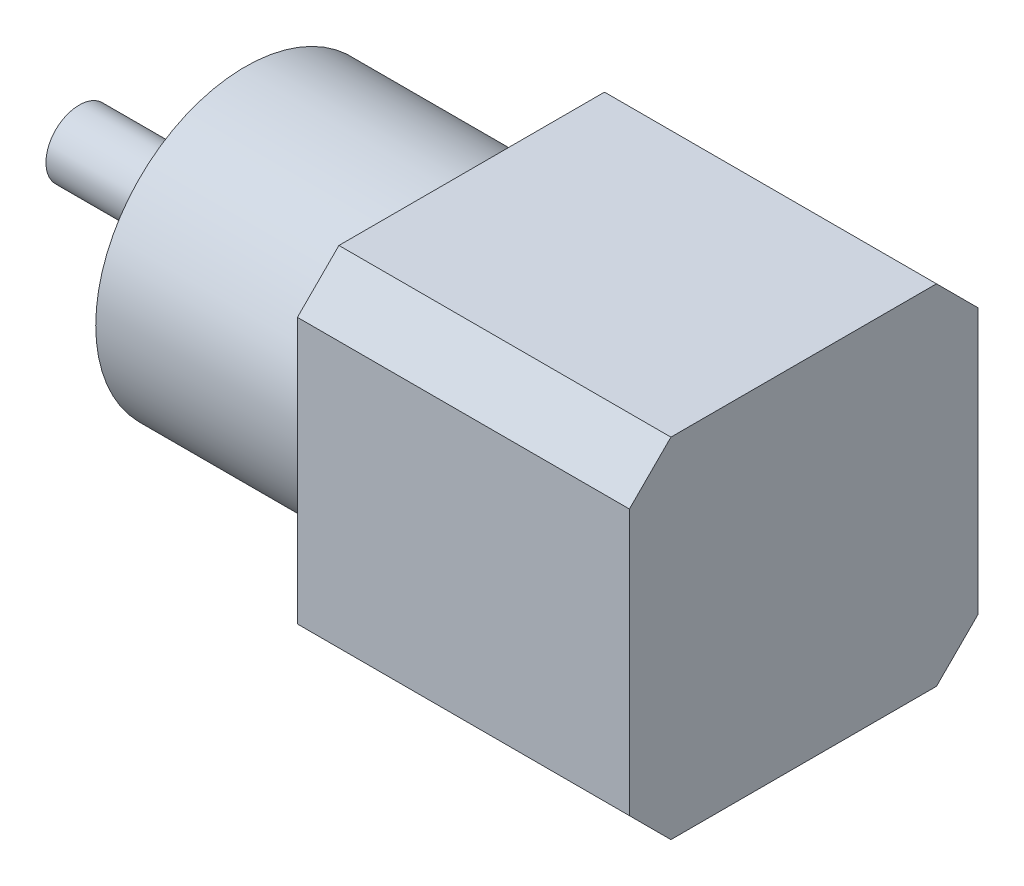
ISO-10303-21;
HEADER;
FILE_DESCRIPTION(('STEP AP214'),'2;1');
FILE_NAME('part.step','',(''),(''),'','','');
FILE_SCHEMA(('AUTOMOTIVE_DESIGN { 1 0 10303 214 1 1 1 1 }'));
ENDSEC;
DATA;
#1=APPLICATION_CONTEXT('core data for automotive mechanical design processes');
#2=APPLICATION_PROTOCOL_DEFINITION('international standard','automotive_design',2000,#1);
#3=PRODUCT_CONTEXT('',#1,'mechanical');
#4=PRODUCT('Part','Part','',(#3));
#5=PRODUCT_RELATED_PRODUCT_CATEGORY('part','',(#4));
#6=PRODUCT_DEFINITION_FORMATION('','',#4);
#7=PRODUCT_DEFINITION_CONTEXT('part definition',#1,'design');
#8=PRODUCT_DEFINITION('design','',#6,#7);
#9=PRODUCT_DEFINITION_SHAPE('','',#8);
#10=(LENGTH_UNIT() NAMED_UNIT(*) SI_UNIT(.MILLI.,.METRE.));
#11=(NAMED_UNIT(*) PLANE_ANGLE_UNIT() SI_UNIT($,.RADIAN.));
#12=(NAMED_UNIT(*) SI_UNIT($,.STERADIAN.) SOLID_ANGLE_UNIT());
#13=UNCERTAINTY_MEASURE_WITH_UNIT(LENGTH_MEASURE(1.E-05),#10,'distance_accuracy_value','');
#14=(GEOMETRIC_REPRESENTATION_CONTEXT(3) GLOBAL_UNCERTAINTY_ASSIGNED_CONTEXT((#13)) GLOBAL_UNIT_ASSIGNED_CONTEXT((#10,
#11,#12)) REPRESENTATION_CONTEXT('',''));
#15=CARTESIAN_POINT('',(0.,0.,0.));
#16=DIRECTION('',(0.,0.,1.));
#17=DIRECTION('',(1.,0.,0.));
#18=AXIS2_PLACEMENT_3D('',#15,#16,#17);
#19=CARTESIAN_POINT('',(49.8,-21.,-10.8));
#20=DIRECTION('',(0.,0.,-1.));
#21=DIRECTION('',(0.,1.,0.));
#22=AXIS2_PLACEMENT_3D('',#19,#20,#21);
#23=PLANE('',#22);
#24=DIRECTION('',(0.,1.,0.));
#25=VECTOR('',#24,1.);
#26=CARTESIAN_POINT('',(89.8,-21.,-10.8));
#27=LINE('',#26,#25);
#28=CARTESIAN_POINT('',(89.8,-16.,-10.8));
#29=VERTEX_POINT('',#28);
#30=CARTESIAN_POINT('',(89.8,16.,-10.8));
#31=VERTEX_POINT('',#30);
#32=EDGE_CURVE('E198',#29,#31,#27,.T.);
#33=ORIENTED_EDGE('',*,*,#32,.F.);
#34=DIRECTION('',(-1.,0.,0.));
#35=VECTOR('',#34,1.);
#36=CARTESIAN_POINT('',(49.8,-16.,-10.8));
#37=LINE('',#36,#35);
#38=CARTESIAN_POINT('',(49.8,-16.,-10.8));
#39=VERTEX_POINT('',#38);
#40=EDGE_CURVE('E238',#29,#39,#37,.T.);
#41=ORIENTED_EDGE('',*,*,#40,.T.);
#42=DIRECTION('',(0.,1.,0.));
#43=VECTOR('',#42,1.);
#44=CARTESIAN_POINT('',(49.8,-21.,-10.8));
#45=LINE('',#44,#43);
#46=CARTESIAN_POINT('',(49.8,16.,-10.8));
#47=VERTEX_POINT('',#46);
#48=EDGE_CURVE('E202',#39,#47,#45,.T.);
#49=ORIENTED_EDGE('',*,*,#48,.T.);
#50=DIRECTION('',(1.,0.,0.));
#51=VECTOR('',#50,1.);
#52=CARTESIAN_POINT('',(49.8,16.,-10.8));
#53=LINE('',#52,#51);
#54=EDGE_CURVE('E235',#47,#31,#53,.T.);
#55=ORIENTED_EDGE('',*,*,#54,.T.);
#56=EDGE_LOOP('',(#33,#41,#49,#55));
#57=FACE_BOUND('',#56,.T.);
#58=ADVANCED_FACE('F48',(#57),#23,.T.);
#59=CARTESIAN_POINT('',(49.8,-21.,31.2));
#60=DIRECTION('',(0.,-1.,0.));
#61=DIRECTION('',(0.,0.,-1.));
#62=AXIS2_PLACEMENT_3D('',#59,#60,#61);
#63=PLANE('',#62);
#64=DIRECTION('',(0.,0.,-1.));
#65=VECTOR('',#64,1.);
#66=CARTESIAN_POINT('',(49.8,-21.,31.2));
#67=LINE('',#66,#65);
#68=CARTESIAN_POINT('',(49.8,-21.,26.2));
#69=VERTEX_POINT('',#68);
#70=CARTESIAN_POINT('',(49.8,-21.,-5.79999999999998));
#71=VERTEX_POINT('',#70);
#72=EDGE_CURVE('E201',#69,#71,#67,.T.);
#73=ORIENTED_EDGE('',*,*,#72,.T.);
#74=DIRECTION('',(1.,0.,0.));
#75=VECTOR('',#74,1.);
#76=CARTESIAN_POINT('',(49.8,-21.,-5.79999999999998));
#77=LINE('',#76,#75);
#78=CARTESIAN_POINT('',(89.8,-21.,-5.79999999999998));
#79=VERTEX_POINT('',#78);
#80=EDGE_CURVE('E224',#71,#79,#77,.T.);
#81=ORIENTED_EDGE('',*,*,#80,.T.);
#82=DIRECTION('',(0.,0.,-1.));
#83=VECTOR('',#82,1.);
#84=CARTESIAN_POINT('',(89.8,-21.,31.2));
#85=LINE('',#84,#83);
#86=CARTESIAN_POINT('',(89.8,-21.,26.2));
#87=VERTEX_POINT('',#86);
#88=EDGE_CURVE('E206',#87,#79,#85,.T.);
#89=ORIENTED_EDGE('',*,*,#88,.F.);
#90=DIRECTION('',(-1.,0.,0.));
#91=VECTOR('',#90,1.);
#92=CARTESIAN_POINT('',(49.8,-21.,26.2));
#93=LINE('',#92,#91);
#94=EDGE_CURVE('E188',#87,#69,#93,.T.);
#95=ORIENTED_EDGE('',*,*,#94,.T.);
#96=EDGE_LOOP('',(#73,#81,#89,#95));
#97=FACE_BOUND('',#96,.T.);
#98=ADVANCED_FACE('F274',(#97),#63,.T.);
#99=CARTESIAN_POINT('',(49.8,-21.,31.2));
#100=DIRECTION('',(0.,0.,1.));
#101=DIRECTION('',(1.,0.,0.));
#102=AXIS2_PLACEMENT_3D('',#99,#100,#101);
#103=PLANE('',#102);
#104=DIRECTION('',(0.,-1.,0.));
#105=VECTOR('',#104,1.);
#106=CARTESIAN_POINT('',(49.8,-21.,31.2));
#107=LINE('',#106,#105);
#108=CARTESIAN_POINT('',(49.8,16.,31.2));
#109=VERTEX_POINT('',#108);
#110=CARTESIAN_POINT('',(49.8,-16.,31.2));
#111=VERTEX_POINT('',#110);
#112=EDGE_CURVE('E208',#109,#111,#107,.T.);
#113=ORIENTED_EDGE('',*,*,#112,.T.);
#114=DIRECTION('',(1.,0.,0.));
#115=VECTOR('',#114,1.);
#116=CARTESIAN_POINT('',(49.8,-16.,31.2));
#117=LINE('',#116,#115);
#118=CARTESIAN_POINT('',(89.8,-16.,31.2));
#119=VERTEX_POINT('',#118);
#120=EDGE_CURVE('E249',#111,#119,#117,.T.);
#121=ORIENTED_EDGE('',*,*,#120,.T.);
#122=DIRECTION('',(0.,-1.,0.));
#123=VECTOR('',#122,1.);
#124=CARTESIAN_POINT('',(89.8,-21.,31.2));
#125=LINE('',#124,#123);
#126=CARTESIAN_POINT('',(89.8,16.,31.2));
#127=VERTEX_POINT('',#126);
#128=EDGE_CURVE('E218',#127,#119,#125,.T.);
#129=ORIENTED_EDGE('',*,*,#128,.F.);
#130=DIRECTION('',(-1.,0.,0.));
#131=VECTOR('',#130,1.);
#132=CARTESIAN_POINT('',(49.8,16.,31.2));
#133=LINE('',#132,#131);
#134=EDGE_CURVE('E247',#127,#109,#133,.T.);
#135=ORIENTED_EDGE('',*,*,#134,.T.);
#136=EDGE_LOOP('',(#113,#121,#129,#135));
#137=FACE_BOUND('',#136,.T.);
#138=ADVANCED_FACE('F281',(#137),#103,.T.);
#139=CARTESIAN_POINT('',(49.8,21.,31.2));
#140=DIRECTION('',(0.,1.,0.));
#141=DIRECTION('',(0.,0.,1.));
#142=AXIS2_PLACEMENT_3D('',#139,#140,#141);
#143=PLANE('',#142);
#144=DIRECTION('',(0.,0.,1.));
#145=VECTOR('',#144,1.);
#146=CARTESIAN_POINT('',(89.8,21.,31.2));
#147=LINE('',#146,#145);
#148=CARTESIAN_POINT('',(89.8,21.,-5.79999999999998));
#149=VERTEX_POINT('',#148);
#150=CARTESIAN_POINT('',(89.8,21.,26.2));
#151=VERTEX_POINT('',#150);
#152=EDGE_CURVE('E215',#149,#151,#147,.T.);
#153=ORIENTED_EDGE('',*,*,#152,.F.);
#154=DIRECTION('',(-1.,0.,0.));
#155=VECTOR('',#154,1.);
#156=CARTESIAN_POINT('',(49.8,21.,-5.8));
#157=LINE('',#156,#155);
#158=CARTESIAN_POINT('',(49.8,21.,-5.79999999999998));
#159=VERTEX_POINT('',#158);
#160=EDGE_CURVE('E11',#149,#159,#157,.T.);
#161=ORIENTED_EDGE('',*,*,#160,.T.);
#162=DIRECTION('',(0.,0.,1.));
#163=VECTOR('',#162,1.);
#164=CARTESIAN_POINT('',(49.8,21.,31.2));
#165=LINE('',#164,#163);
#166=CARTESIAN_POINT('',(49.8,21.,26.2));
#167=VERTEX_POINT('',#166);
#168=EDGE_CURVE('E205',#159,#167,#165,.T.);
#169=ORIENTED_EDGE('',*,*,#168,.T.);
#170=DIRECTION('',(1.,0.,0.));
#171=VECTOR('',#170,1.);
#172=CARTESIAN_POINT('',(49.8,21.,26.2));
#173=LINE('',#172,#171);
#174=EDGE_CURVE('E57',#167,#151,#173,.T.);
#175=ORIENTED_EDGE('',*,*,#174,.T.);
#176=EDGE_LOOP('',(#153,#161,#169,#175));
#177=FACE_BOUND('',#176,.T.);
#178=ADVANCED_FACE('F253',(#177),#143,.T.);
#179=CARTESIAN_POINT('',(49.8,0.,0.));
#180=DIRECTION('',(-1.,0.,0.));
#181=DIRECTION('',(0.,0.,1.));
#182=AXIS2_PLACEMENT_3D('',#179,#180,#181);
#183=PLANE('',#182);
#184=CARTESIAN_POINT('',(49.8,0.,10.2));
#185=DIRECTION('',(-1.,0.,0.));
#186=DIRECTION('',(0.,0.,1.));
#187=AXIS2_PLACEMENT_3D('',#184,#185,#186);
#188=CIRCLE('',#187,18.);
#189=CARTESIAN_POINT('',(49.8,0.,28.2));
#190=VERTEX_POINT('',#189);
#191=EDGE_CURVE('E195',#190,#190,#188,.T.);
#192=ORIENTED_EDGE('',*,*,#191,.F.);
#193=EDGE_LOOP('',(#192));
#194=FACE_BOUND('',#193,.T.);
#195=ORIENTED_EDGE('',*,*,#48,.F.);
#196=DIRECTION('',(0.,0.707106781186549,-0.707106781186546));
#197=VECTOR('',#196,1.);
#198=CARTESIAN_POINT('',(49.8,-13.4,-13.4));
#199=LINE('',#198,#197);
#200=EDGE_CURVE('E245',#39,#71,#199,.F.);
#201=ORIENTED_EDGE('',*,*,#200,.T.);
#202=ORIENTED_EDGE('',*,*,#72,.F.);
#203=DIRECTION('',(0.,-0.707106781186547,-0.707106781186549));
#204=VECTOR('',#203,1.);
#205=CARTESIAN_POINT('',(49.8,-23.6,23.6));
#206=LINE('',#205,#204);
#207=EDGE_CURVE('E243',#69,#111,#206,.F.);
#208=ORIENTED_EDGE('',*,*,#207,.T.);
#209=ORIENTED_EDGE('',*,*,#112,.F.);
#210=DIRECTION('',(0.,-0.707106781186549,0.707106781186547));
#211=VECTOR('',#210,1.);
#212=CARTESIAN_POINT('',(49.8,23.6,23.6));
#213=LINE('',#212,#211);
#214=EDGE_CURVE('E64',#109,#167,#213,.F.);
#215=ORIENTED_EDGE('',*,*,#214,.T.);
#216=ORIENTED_EDGE('',*,*,#168,.F.);
#217=DIRECTION('',(0.,0.707106781186547,0.707106781186548));
#218=VECTOR('',#217,1.);
#219=CARTESIAN_POINT('',(49.8,13.4,-13.4));
#220=LINE('',#219,#218);
#221=EDGE_CURVE('E241',#159,#47,#220,.F.);
#222=ORIENTED_EDGE('',*,*,#221,.T.);
#223=EDGE_LOOP('',(#195,#201,#202,#208,#209,#215,#216,#222));
#224=FACE_BOUND('',#223,.T.);
#225=ADVANCED_FACE('F267',(#194,#224),#183,.T.);
#226=CARTESIAN_POINT('',(89.8,0.,0.));
#227=DIRECTION('',(-1.,0.,0.));
#228=DIRECTION('',(0.,0.,1.));
#229=AXIS2_PLACEMENT_3D('',#226,#227,#228);
#230=PLANE('',#229);
#231=ORIENTED_EDGE('',*,*,#88,.T.);
#232=DIRECTION('',(0.,-0.707106781186549,0.707106781186546));
#233=VECTOR('',#232,1.);
#234=CARTESIAN_POINT('',(89.8,-21.,-5.79999999999998));
#235=LINE('',#234,#233);
#236=EDGE_CURVE('E233',#79,#29,#235,.F.);
#237=ORIENTED_EDGE('',*,*,#236,.T.);
#238=ORIENTED_EDGE('',*,*,#32,.T.);
#239=DIRECTION('',(0.,-0.707106781186547,-0.707106781186548));
#240=VECTOR('',#239,1.);
#241=CARTESIAN_POINT('',(89.8,16.,-10.8));
#242=LINE('',#241,#240);
#243=EDGE_CURVE('E229',#31,#149,#242,.F.);
#244=ORIENTED_EDGE('',*,*,#243,.T.);
#245=ORIENTED_EDGE('',*,*,#152,.T.);
#246=DIRECTION('',(0.,0.707106781186549,-0.707106781186547));
#247=VECTOR('',#246,1.);
#248=CARTESIAN_POINT('',(89.8,21.,26.2));
#249=LINE('',#248,#247);
#250=EDGE_CURVE('E227',#151,#127,#249,.F.);
#251=ORIENTED_EDGE('',*,*,#250,.T.);
#252=ORIENTED_EDGE('',*,*,#128,.T.);
#253=DIRECTION('',(0.,0.707106781186547,0.707106781186549));
#254=VECTOR('',#253,1.);
#255=CARTESIAN_POINT('',(89.8,-16.,31.2));
#256=LINE('',#255,#254);
#257=EDGE_CURVE('E231',#119,#87,#256,.F.);
#258=ORIENTED_EDGE('',*,*,#257,.T.);
#259=EDGE_LOOP('',(#231,#237,#238,#244,#245,#251,#252,#258));
#260=FACE_BOUND('',#259,.T.);
#261=ADVANCED_FACE('F256',(#260),#230,.F.);
#262=CARTESIAN_POINT('',(22.5,0.,10.2));
#263=DIRECTION('',(1.,0.,0.));
#264=DIRECTION('',(0.,0.,-1.));
#265=AXIS2_PLACEMENT_3D('',#262,#263,#264);
#266=CYLINDRICAL_SURFACE('',#265,18.);
#267=CARTESIAN_POINT('',(22.5,0.,10.2));
#268=DIRECTION('',(-1.,0.,0.));
#269=DIRECTION('',(0.,0.,1.));
#270=AXIS2_PLACEMENT_3D('',#267,#268,#269);
#271=CIRCLE('',#270,18.);
#272=CARTESIAN_POINT('',(22.5,0.,28.2));
#273=VERTEX_POINT('',#272);
#274=EDGE_CURVE('E192',#273,#273,#271,.T.);
#275=ORIENTED_EDGE('',*,*,#274,.F.);
#276=EDGE_LOOP('',(#275));
#277=FACE_BOUND('',#276,.T.);
#278=ORIENTED_EDGE('',*,*,#191,.T.);
#279=EDGE_LOOP('',(#278));
#280=FACE_BOUND('',#279,.T.);
#281=ADVANCED_FACE('F465',(#277,#280),#266,.T.);
#282=CARTESIAN_POINT('',(22.5,0.,10.2));
#283=DIRECTION('',(-1.,0.,0.));
#284=DIRECTION('',(0.,0.,1.));
#285=AXIS2_PLACEMENT_3D('',#282,#283,#284);
#286=PLANE('',#285);
#287=CARTESIAN_POINT('',(22.5,-9.89949493661154,0.30050506338822));
#288=DIRECTION('',(-1.,0.,0.));
#289=DIRECTION('',(0.,0.,1.));
#290=AXIS2_PLACEMENT_3D('',#287,#288,#289);
#291=CIRCLE('',#290,1.24999999999999);
#292=CARTESIAN_POINT('',(22.5,-9.89949493661154,1.55050506338821));
#293=VERTEX_POINT('',#292);
#294=EDGE_CURVE('E147',#293,#293,#291,.T.);
#295=ORIENTED_EDGE('',*,*,#294,.F.);
#296=EDGE_LOOP('',(#295));
#297=FACE_BOUND('',#296,.T.);
#298=CARTESIAN_POINT('',(22.5,-9.89949493661168,20.0994949366117));
#299=DIRECTION('',(-1.,0.,0.));
#300=DIRECTION('',(0.,0.,1.));
#301=AXIS2_PLACEMENT_3D('',#298,#299,#300);
#302=CIRCLE('',#301,1.24999999999999);
#303=CARTESIAN_POINT('',(22.5,-9.89949493661168,21.3494949366116));
#304=VERTEX_POINT('',#303);
#305=EDGE_CURVE('E146',#304,#304,#302,.T.);
#306=ORIENTED_EDGE('',*,*,#305,.F.);
#307=EDGE_LOOP('',(#306));
#308=FACE_BOUND('',#307,.T.);
#309=CARTESIAN_POINT('',(22.5,9.89949493661161,20.0994949366117));
#310=DIRECTION('',(-1.,0.,0.));
#311=DIRECTION('',(0.,0.,1.));
#312=AXIS2_PLACEMENT_3D('',#309,#310,#311);
#313=CIRCLE('',#312,1.24999999999999);
#314=CARTESIAN_POINT('',(22.5,9.89949493661161,21.3494949366117));
#315=VERTEX_POINT('',#314);
#316=EDGE_CURVE('E157',#315,#315,#313,.T.);
#317=ORIENTED_EDGE('',*,*,#316,.F.);
#318=EDGE_LOOP('',(#317));
#319=FACE_BOUND('',#318,.T.);
#320=CARTESIAN_POINT('',(22.5,9.89949493661168,0.300505063388355));
#321=DIRECTION('',(-1.,0.,0.));
#322=DIRECTION('',(0.,0.,1.));
#323=AXIS2_PLACEMENT_3D('',#320,#321,#322);
#324=CIRCLE('',#323,1.24999999999999);
#325=CARTESIAN_POINT('',(22.5,9.89949493661168,1.55050506338834));
#326=VERTEX_POINT('',#325);
#327=EDGE_CURVE('E163',#326,#326,#324,.T.);
#328=ORIENTED_EDGE('',*,*,#327,.F.);
#329=EDGE_LOOP('',(#328));
#330=FACE_BOUND('',#329,.T.);
#331=CARTESIAN_POINT('',(22.5,0.,10.2));
#332=DIRECTION('',(-1.,0.,0.));
#333=DIRECTION('',(0.,0.,1.));
#334=AXIS2_PLACEMENT_3D('',#331,#332,#333);
#335=CIRCLE('',#334,11.);
#336=CARTESIAN_POINT('',(22.5,0.,21.2));
#337=VERTEX_POINT('',#336);
#338=EDGE_CURVE('E189',#337,#337,#335,.T.);
#339=ORIENTED_EDGE('',*,*,#338,.F.);
#340=EDGE_LOOP('',(#339));
#341=FACE_BOUND('',#340,.T.);
#342=ORIENTED_EDGE('',*,*,#274,.T.);
#343=EDGE_LOOP('',(#342));
#344=FACE_BOUND('',#343,.T.);
#345=ADVANCED_FACE('F455',(#297,#308,#319,#330,#341,#344),#286,.T.);
#346=CARTESIAN_POINT('',(20.5,0.,10.2));
#347=DIRECTION('',(1.,0.,0.));
#348=DIRECTION('',(0.,0.,-1.));
#349=AXIS2_PLACEMENT_3D('',#346,#347,#348);
#350=CYLINDRICAL_SURFACE('',#349,11.);
#351=CARTESIAN_POINT('',(20.5,0.,10.2));
#352=DIRECTION('',(-1.,0.,0.));
#353=DIRECTION('',(0.,0.,1.));
#354=AXIS2_PLACEMENT_3D('',#351,#352,#353);
#355=CIRCLE('',#354,11.);
#356=CARTESIAN_POINT('',(20.5,0.,21.2));
#357=VERTEX_POINT('',#356);
#358=EDGE_CURVE('E184',#357,#357,#355,.T.);
#359=ORIENTED_EDGE('',*,*,#358,.F.);
#360=EDGE_LOOP('',(#359));
#361=FACE_BOUND('',#360,.T.);
#362=ORIENTED_EDGE('',*,*,#338,.T.);
#363=EDGE_LOOP('',(#362));
#364=FACE_BOUND('',#363,.T.);
#365=ADVANCED_FACE('F446',(#361,#364),#350,.T.);
#366=CARTESIAN_POINT('',(20.5,0.,10.2));
#367=DIRECTION('',(-1.,0.,0.));
#368=DIRECTION('',(0.,0.,1.));
#369=AXIS2_PLACEMENT_3D('',#366,#367,#368);
#370=PLANE('',#369);
#371=CARTESIAN_POINT('',(20.5,0.,10.2));
#372=DIRECTION('',(-1.,0.,0.));
#373=DIRECTION('',(0.,0.,1.));
#374=AXIS2_PLACEMENT_3D('',#371,#372,#373);
#375=CIRCLE('',#374,4.00000000000001);
#376=CARTESIAN_POINT('',(20.5,0.,14.2));
#377=VERTEX_POINT('',#376);
#378=EDGE_CURVE('E185',#377,#377,#375,.T.);
#379=ORIENTED_EDGE('',*,*,#378,.F.);
#380=EDGE_LOOP('',(#379));
#381=FACE_BOUND('',#380,.T.);
#382=ORIENTED_EDGE('',*,*,#358,.T.);
#383=EDGE_LOOP('',(#382));
#384=FACE_BOUND('',#383,.T.);
#385=ADVANCED_FACE('F437',(#381,#384),#370,.T.);
#386=CARTESIAN_POINT('',(2.50000000000004,0.,10.2));
#387=DIRECTION('',(1.,0.,0.));
#388=DIRECTION('',(0.,0.,-1.));
#389=AXIS2_PLACEMENT_3D('',#386,#387,#388);
#390=CYLINDRICAL_SURFACE('',#389,4.00000000000001);
#391=CARTESIAN_POINT('',(2.50000000000004,0.,10.2));
#392=DIRECTION('',(-1.,0.,0.));
#393=DIRECTION('',(0.,0.,1.));
#394=AXIS2_PLACEMENT_3D('',#391,#392,#393);
#395=CIRCLE('',#394,4.00000000000001);
#396=CARTESIAN_POINT('',(2.50000000000004,-2.6457513110646,7.2));
#397=VERTEX_POINT('',#396);
#398=CARTESIAN_POINT('',(2.50000000000004,2.6457513110646,7.2));
#399=VERTEX_POINT('',#398);
#400=EDGE_CURVE('E180',#397,#399,#395,.T.);
#401=ORIENTED_EDGE('',*,*,#400,.F.);
#402=DIRECTION('',(-1.,0.,0.));
#403=VECTOR('',#402,1.);
#404=CARTESIAN_POINT('',(17.5,-2.6457513110646,7.2));
#405=LINE('',#404,#403);
#406=CARTESIAN_POINT('',(17.5,-2.6457513110646,7.2));
#407=VERTEX_POINT('',#406);
#408=EDGE_CURVE('E175',#407,#397,#405,.T.);
#409=ORIENTED_EDGE('',*,*,#408,.F.);
#410=CARTESIAN_POINT('',(17.5,0.,10.2));
#411=DIRECTION('',(-1.,0.,0.));
#412=DIRECTION('',(0.,0.,1.));
#413=AXIS2_PLACEMENT_3D('',#410,#411,#412);
#414=CIRCLE('',#413,4.00000000000001);
#415=CARTESIAN_POINT('',(17.5,2.6457513110646,7.2));
#416=VERTEX_POINT('',#415);
#417=EDGE_CURVE('E170',#416,#407,#414,.T.);
#418=ORIENTED_EDGE('',*,*,#417,.F.);
#419=DIRECTION('',(-1.,0.,0.));
#420=VECTOR('',#419,1.);
#421=CARTESIAN_POINT('',(17.5,2.6457513110646,7.2));
#422=LINE('',#421,#420);
#423=EDGE_CURVE('E177',#416,#399,#422,.T.);
#424=ORIENTED_EDGE('',*,*,#423,.T.);
#425=EDGE_LOOP('',(#401,#409,#418,#424));
#426=FACE_BOUND('',#425,.T.);
#427=ORIENTED_EDGE('',*,*,#378,.T.);
#428=EDGE_LOOP('',(#427));
#429=FACE_BOUND('',#428,.T.);
#430=ADVANCED_FACE('F428',(#426,#429),#390,.T.);
#431=CARTESIAN_POINT('',(2.50000000000004,0.,10.2));
#432=DIRECTION('',(-1.,0.,0.));
#433=DIRECTION('',(0.,0.,1.));
#434=AXIS2_PLACEMENT_3D('',#431,#432,#433);
#435=PLANE('',#434);
#436=DIRECTION('',(0.,1.,0.));
#437=VECTOR('',#436,1.);
#438=CARTESIAN_POINT('',(2.50000000000004,2.6457513110646,7.2));
#439=LINE('',#438,#437);
#440=EDGE_CURVE('E169',#397,#399,#439,.T.);
#441=ORIENTED_EDGE('',*,*,#440,.F.);
#442=ORIENTED_EDGE('',*,*,#400,.T.);
#443=EDGE_LOOP('',(#441,#442));
#444=FACE_BOUND('',#443,.T.);
#445=ADVANCED_FACE('F419',(#444),#435,.T.);
#446=CARTESIAN_POINT('',(17.5,2.6457513110646,7.2));
#447=DIRECTION('',(0.,0.,1.));
#448=DIRECTION('',(1.,0.,0.));
#449=AXIS2_PLACEMENT_3D('',#446,#447,#448);
#450=PLANE('',#449);
#451=ORIENTED_EDGE('',*,*,#440,.T.);
#452=ORIENTED_EDGE('',*,*,#423,.F.);
#453=DIRECTION('',(0.,1.,0.));
#454=VECTOR('',#453,1.);
#455=CARTESIAN_POINT('',(17.5,2.6457513110646,7.2));
#456=LINE('',#455,#454);
#457=EDGE_CURVE('E172',#407,#416,#456,.T.);
#458=ORIENTED_EDGE('',*,*,#457,.F.);
#459=ORIENTED_EDGE('',*,*,#408,.T.);
#460=EDGE_LOOP('',(#451,#452,#458,#459));
#461=FACE_BOUND('',#460,.T.);
#462=ADVANCED_FACE('F410',(#461),#450,.F.);
#463=CARTESIAN_POINT('',(17.5,0.,10.2));
#464=DIRECTION('',(-1.,0.,0.));
#465=DIRECTION('',(0.,0.,1.));
#466=AXIS2_PLACEMENT_3D('',#463,#464,#465);
#467=PLANE('',#466);
#468=ORIENTED_EDGE('',*,*,#417,.T.);
#469=ORIENTED_EDGE('',*,*,#457,.T.);
#470=EDGE_LOOP('',(#468,#469));
#471=FACE_BOUND('',#470,.T.);
#472=ADVANCED_FACE('F401',(#471),#467,.T.);
#473=CARTESIAN_POINT('',(30.,9.89949493661168,0.300505063388355));
#474=DIRECTION('',(-1.,0.,0.));
#475=DIRECTION('',(0.,0.,1.));
#476=AXIS2_PLACEMENT_3D('',#473,#474,#475);
#477=CONICAL_SURFACE('',#476,1.24999999999999,1.02974425867665);
#478=CARTESIAN_POINT('',(30.7510757737845,9.89949493661168,0.300505063388355));
#479=VERTEX_POINT('',#478);
#480=VERTEX_LOOP('',#479);
#481=FACE_BOUND('',#480,.T.);
#482=CARTESIAN_POINT('',(30.,9.89949493661168,0.300505063388355));
#483=DIRECTION('',(-1.,0.,0.));
#484=DIRECTION('',(0.,0.,1.));
#485=AXIS2_PLACEMENT_3D('',#482,#483,#484);
#486=CIRCLE('',#485,1.24999999999999);
#487=CARTESIAN_POINT('',(30.,9.89949493661168,1.55050506338834));
#488=VERTEX_POINT('',#487);
#489=EDGE_CURVE('E166',#488,#488,#486,.T.);
#490=ORIENTED_EDGE('',*,*,#489,.T.);
#491=EDGE_LOOP('',(#490));
#492=FACE_BOUND('',#491,.T.);
#493=ADVANCED_FACE('F391',(#481,#492),#477,.F.);
#494=CARTESIAN_POINT('',(22.5,9.89949493661168,0.300505063388355));
#495=DIRECTION('',(-1.,0.,0.));
#496=DIRECTION('',(0.,0.,1.));
#497=AXIS2_PLACEMENT_3D('',#494,#495,#496);
#498=CYLINDRICAL_SURFACE('',#497,1.24999999999999);
#499=ORIENTED_EDGE('',*,*,#489,.F.);
#500=EDGE_LOOP('',(#499));
#501=FACE_BOUND('',#500,.T.);
#502=ORIENTED_EDGE('',*,*,#327,.T.);
#503=EDGE_LOOP('',(#502));
#504=FACE_BOUND('',#503,.T.);
#505=ADVANCED_FACE('F381',(#501,#504),#498,.F.);
#506=CARTESIAN_POINT('',(30.,9.89949493661161,20.0994949366117));
#507=DIRECTION('',(-1.,0.,0.));
#508=DIRECTION('',(0.,0.,1.));
#509=AXIS2_PLACEMENT_3D('',#506,#507,#508);
#510=CONICAL_SURFACE('',#509,1.24999999999999,1.02974425867665);
#511=CARTESIAN_POINT('',(30.7510757737845,9.89949493661161,20.0994949366117));
#512=VERTEX_POINT('',#511);
#513=VERTEX_LOOP('',#512);
#514=FACE_BOUND('',#513,.T.);
#515=CARTESIAN_POINT('',(30.,9.89949493661161,20.0994949366117));
#516=DIRECTION('',(-1.,0.,0.));
#517=DIRECTION('',(0.,0.,1.));
#518=AXIS2_PLACEMENT_3D('',#515,#516,#517);
#519=CIRCLE('',#518,1.24999999999999);
#520=CARTESIAN_POINT('',(30.,9.89949493661161,21.3494949366117));
#521=VERTEX_POINT('',#520);
#522=EDGE_CURVE('E160',#521,#521,#519,.T.);
#523=ORIENTED_EDGE('',*,*,#522,.T.);
#524=EDGE_LOOP('',(#523));
#525=FACE_BOUND('',#524,.T.);
#526=ADVANCED_FACE('F371',(#514,#525),#510,.F.);
#527=CARTESIAN_POINT('',(22.5,9.89949493661161,20.0994949366117));
#528=DIRECTION('',(-1.,0.,0.));
#529=DIRECTION('',(0.,0.,1.));
#530=AXIS2_PLACEMENT_3D('',#527,#528,#529);
#531=CYLINDRICAL_SURFACE('',#530,1.24999999999999);
#532=ORIENTED_EDGE('',*,*,#522,.F.);
#533=EDGE_LOOP('',(#532));
#534=FACE_BOUND('',#533,.T.);
#535=ORIENTED_EDGE('',*,*,#316,.T.);
#536=EDGE_LOOP('',(#535));
#537=FACE_BOUND('',#536,.T.);
#538=ADVANCED_FACE('F362',(#534,#537),#531,.F.);
#539=CARTESIAN_POINT('',(30.,-9.89949493661168,20.0994949366117));
#540=DIRECTION('',(-1.,0.,0.));
#541=DIRECTION('',(0.,0.,1.));
#542=AXIS2_PLACEMENT_3D('',#539,#540,#541);
#543=CONICAL_SURFACE('',#542,1.24999999999999,1.02974425867665);
#544=CARTESIAN_POINT('',(30.7510757737845,-9.89949493661168,20.0994949366117));
#545=VERTEX_POINT('',#544);
#546=VERTEX_LOOP('',#545);
#547=FACE_BOUND('',#546,.T.);
#548=CARTESIAN_POINT('',(30.,-9.89949493661168,20.0994949366117));
#549=DIRECTION('',(-1.,0.,0.));
#550=DIRECTION('',(0.,0.,1.));
#551=AXIS2_PLACEMENT_3D('',#548,#549,#550);
#552=CIRCLE('',#551,1.24999999999999);
#553=CARTESIAN_POINT('',(30.,-9.89949493661168,21.3494949366116));
#554=VERTEX_POINT('',#553);
#555=EDGE_CURVE('E150',#554,#554,#552,.T.);
#556=ORIENTED_EDGE('',*,*,#555,.T.);
#557=EDGE_LOOP('',(#556));
#558=FACE_BOUND('',#557,.T.);
#559=ADVANCED_FACE('F352',(#547,#558),#543,.F.);
#560=CARTESIAN_POINT('',(22.5,-9.89949493661168,20.0994949366117));
#561=DIRECTION('',(-1.,0.,0.));
#562=DIRECTION('',(0.,0.,1.));
#563=AXIS2_PLACEMENT_3D('',#560,#561,#562);
#564=CYLINDRICAL_SURFACE('',#563,1.24999999999999);
#565=ORIENTED_EDGE('',*,*,#555,.F.);
#566=EDGE_LOOP('',(#565));
#567=FACE_BOUND('',#566,.T.);
#568=ORIENTED_EDGE('',*,*,#305,.T.);
#569=EDGE_LOOP('',(#568));
#570=FACE_BOUND('',#569,.T.);
#571=ADVANCED_FACE('F140',(#567,#570),#564,.F.);
#572=CARTESIAN_POINT('',(30.,-9.89949493661154,0.30050506338822));
#573=DIRECTION('',(-1.,0.,0.));
#574=DIRECTION('',(0.,0.,1.));
#575=AXIS2_PLACEMENT_3D('',#572,#573,#574);
#576=CONICAL_SURFACE('',#575,1.24999999999999,1.02974425867665);
#577=CARTESIAN_POINT('',(30.7510757737845,-9.89949493661155,0.30050506338822));
#578=VERTEX_POINT('',#577);
#579=VERTEX_LOOP('',#578);
#580=FACE_BOUND('',#579,.T.);
#581=CARTESIAN_POINT('',(30.,-9.89949493661154,0.30050506338822));
#582=DIRECTION('',(-1.,0.,0.));
#583=DIRECTION('',(0.,0.,1.));
#584=AXIS2_PLACEMENT_3D('',#581,#582,#583);
#585=CIRCLE('',#584,1.24999999999999);
#586=CARTESIAN_POINT('',(30.,-9.89949493661154,1.55050506338821));
#587=VERTEX_POINT('',#586);
#588=EDGE_CURVE('E144',#587,#587,#585,.T.);
#589=ORIENTED_EDGE('',*,*,#588,.T.);
#590=EDGE_LOOP('',(#589));
#591=FACE_BOUND('',#590,.T.);
#592=ADVANCED_FACE('F136',(#580,#591),#576,.F.);
#593=CARTESIAN_POINT('',(22.5,-9.89949493661154,0.30050506338822));
#594=DIRECTION('',(-1.,0.,0.));
#595=DIRECTION('',(0.,0.,1.));
#596=AXIS2_PLACEMENT_3D('',#593,#594,#595);
#597=CYLINDRICAL_SURFACE('',#596,1.24999999999999);
#598=ORIENTED_EDGE('',*,*,#588,.F.);
#599=EDGE_LOOP('',(#598));
#600=FACE_BOUND('',#599,.T.);
#601=ORIENTED_EDGE('',*,*,#294,.T.);
#602=EDGE_LOOP('',(#601));
#603=FACE_BOUND('',#602,.T.);
#604=ADVANCED_FACE('F139',(#600,#603),#597,.F.);
#605=CARTESIAN_POINT('',(49.8,-21.,-5.79999999999998));
#606=DIRECTION('',(0.,0.707106781186546,0.707106781186549));
#607=DIRECTION('',(1.,0.,0.));
#608=AXIS2_PLACEMENT_3D('',#605,#606,#607);
#609=PLANE('',#608);
#610=ORIENTED_EDGE('',*,*,#200,.F.);
#611=ORIENTED_EDGE('',*,*,#40,.F.);
#612=ORIENTED_EDGE('',*,*,#236,.F.);
#613=ORIENTED_EDGE('',*,*,#80,.F.);
#614=EDGE_LOOP('',(#610,#611,#612,#613));
#615=FACE_BOUND('',#614,.T.);
#616=ADVANCED_FACE('F271',(#615),#609,.F.);
#617=CARTESIAN_POINT('',(49.8,-16.,31.2));
#618=DIRECTION('',(0.,0.707106781186549,-0.707106781186547));
#619=DIRECTION('',(1.,0.,0.));
#620=AXIS2_PLACEMENT_3D('',#617,#618,#619);
#621=PLANE('',#620);
#622=ORIENTED_EDGE('',*,*,#207,.F.);
#623=ORIENTED_EDGE('',*,*,#94,.F.);
#624=ORIENTED_EDGE('',*,*,#257,.F.);
#625=ORIENTED_EDGE('',*,*,#120,.F.);
#626=EDGE_LOOP('',(#622,#623,#624,#625));
#627=FACE_BOUND('',#626,.T.);
#628=ADVANCED_FACE('F279',(#627),#621,.F.);
#629=CARTESIAN_POINT('',(49.8,16.,-10.8));
#630=DIRECTION('',(0.,-0.707106781186548,0.707106781186547));
#631=DIRECTION('',(1.,0.,0.));
#632=AXIS2_PLACEMENT_3D('',#629,#630,#631);
#633=PLANE('',#632);
#634=ORIENTED_EDGE('',*,*,#221,.F.);
#635=ORIENTED_EDGE('',*,*,#160,.F.);
#636=ORIENTED_EDGE('',*,*,#243,.F.);
#637=ORIENTED_EDGE('',*,*,#54,.F.);
#638=EDGE_LOOP('',(#634,#635,#636,#637));
#639=FACE_BOUND('',#638,.T.);
#640=ADVANCED_FACE('F262',(#639),#633,.F.);
#641=CARTESIAN_POINT('',(49.8,21.,26.2));
#642=DIRECTION('',(0.,-0.707106781186546,-0.707106781186548));
#643=DIRECTION('',(1.,0.,0.));
#644=AXIS2_PLACEMENT_3D('',#641,#642,#643);
#645=PLANE('',#644);
#646=ORIENTED_EDGE('',*,*,#214,.F.);
#647=ORIENTED_EDGE('',*,*,#134,.F.);
#648=ORIENTED_EDGE('',*,*,#250,.F.);
#649=ORIENTED_EDGE('',*,*,#174,.F.);
#650=EDGE_LOOP('',(#646,#647,#648,#649));
#651=FACE_BOUND('',#650,.T.);
#652=ADVANCED_FACE('F51',(#651),#645,.F.);
#653=CLOSED_SHELL('',(#58,#98,#138,#178,#225,#261,#281,#345,#365,#385,#430,#445,#462,#472,#493,
#505,#526,#538,#559,#571,#592,#604,#616,#628,#640,#652));
#654=MANIFOLD_SOLID_BREP('B2',#653);
#655=ADVANCED_BREP_SHAPE_REPRESENTATION('',(#18,#654),#14);
#656=SHAPE_DEFINITION_REPRESENTATION(#9,#655);
ENDSEC;
END-ISO-10303-21;
